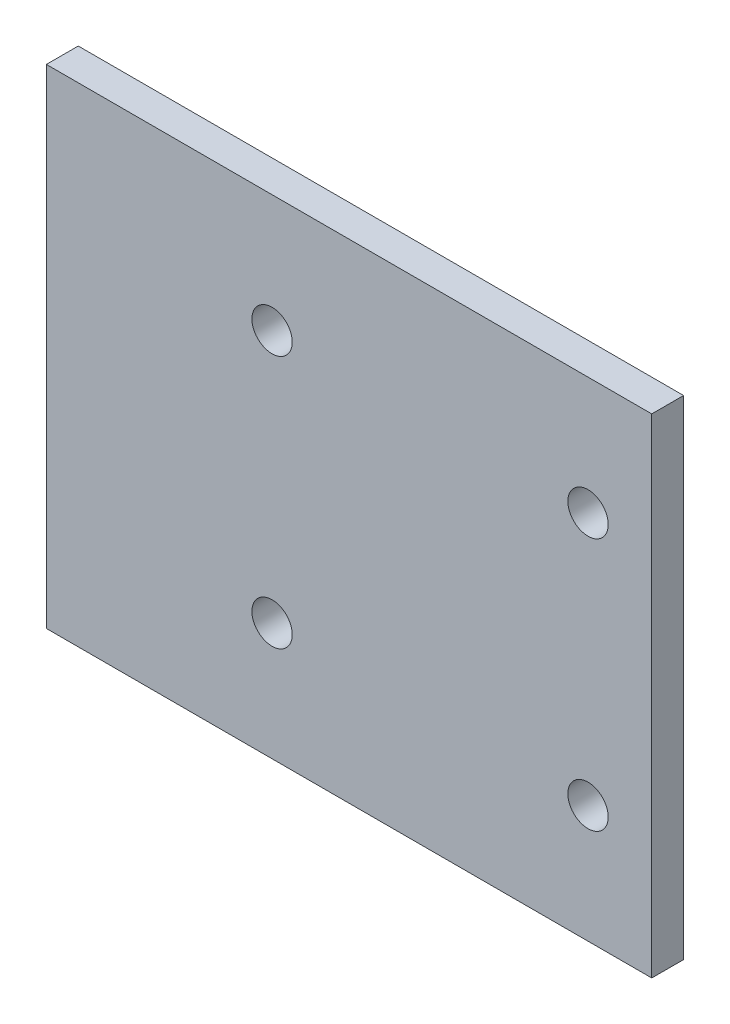
ISO-10303-21;
HEADER;
FILE_DESCRIPTION(('STEP AP214'),'2;1');
FILE_NAME('part.step','',(''),(''),'','','');
FILE_SCHEMA(('AUTOMOTIVE_DESIGN { 1 0 10303 214 1 1 1 1 }'));
ENDSEC;
DATA;
#1=APPLICATION_CONTEXT('core data for automotive mechanical design processes');
#2=APPLICATION_PROTOCOL_DEFINITION('international standard','automotive_design',2000,#1);
#3=PRODUCT_CONTEXT('',#1,'mechanical');
#4=PRODUCT('Part','Part','',(#3));
#5=PRODUCT_RELATED_PRODUCT_CATEGORY('part','',(#4));
#6=PRODUCT_DEFINITION_FORMATION('','',#4);
#7=PRODUCT_DEFINITION_CONTEXT('part definition',#1,'design');
#8=PRODUCT_DEFINITION('design','',#6,#7);
#9=PRODUCT_DEFINITION_SHAPE('','',#8);
#10=(LENGTH_UNIT() NAMED_UNIT(*) SI_UNIT(.MILLI.,.METRE.));
#11=(NAMED_UNIT(*) PLANE_ANGLE_UNIT() SI_UNIT($,.RADIAN.));
#12=(NAMED_UNIT(*) SI_UNIT($,.STERADIAN.) SOLID_ANGLE_UNIT());
#13=UNCERTAINTY_MEASURE_WITH_UNIT(LENGTH_MEASURE(1.E-05),#10,'distance_accuracy_value','');
#14=(GEOMETRIC_REPRESENTATION_CONTEXT(3) GLOBAL_UNCERTAINTY_ASSIGNED_CONTEXT((#13)) GLOBAL_UNIT_ASSIGNED_CONTEXT((#10,
#11,#12)) REPRESENTATION_CONTEXT('',''));
#15=CARTESIAN_POINT('',(0.,0.,0.));
#16=DIRECTION('',(0.,0.,1.));
#17=DIRECTION('',(1.,0.,0.));
#18=AXIS2_PLACEMENT_3D('',#15,#16,#17);
#19=CARTESIAN_POINT('',(-36.0143442622951,24.5901639344262,3.));
#20=DIRECTION('',(1.,0.,0.));
#21=DIRECTION('',(0.,0.,-1.));
#22=AXIS2_PLACEMENT_3D('',#19,#20,#21);
#23=PLANE('',#22);
#24=DIRECTION('',(0.,-1.,0.));
#25=VECTOR('',#24,1.);
#26=CARTESIAN_POINT('',(-36.0143442622951,24.5901639344262,0.));
#27=LINE('',#26,#25);
#28=CARTESIAN_POINT('',(-36.0143442622951,24.5901639344262,0.));
#29=VERTEX_POINT('',#28);
#30=CARTESIAN_POINT('',(-36.0143442622951,-21.4098360655738,0.));
#31=VERTEX_POINT('',#30);
#32=EDGE_CURVE('E96',#29,#31,#27,.T.);
#33=ORIENTED_EDGE('',*,*,#32,.T.);
#34=DIRECTION('',(0.,0.,-1.));
#35=VECTOR('',#34,1.);
#36=CARTESIAN_POINT('',(-36.0143442622951,-21.4098360655738,3.));
#37=LINE('',#36,#35);
#38=CARTESIAN_POINT('',(-36.0143442622951,-21.4098360655738,3.));
#39=VERTEX_POINT('',#38);
#40=EDGE_CURVE('E11',#39,#31,#37,.T.);
#41=ORIENTED_EDGE('',*,*,#40,.F.);
#42=DIRECTION('',(0.,-1.,0.));
#43=VECTOR('',#42,1.);
#44=CARTESIAN_POINT('',(-36.0143442622951,24.5901639344262,3.));
#45=LINE('',#44,#43);
#46=CARTESIAN_POINT('',(-36.0143442622951,24.5901639344262,3.));
#47=VERTEX_POINT('',#46);
#48=EDGE_CURVE('E84',#47,#39,#45,.T.);
#49=ORIENTED_EDGE('',*,*,#48,.F.);
#50=DIRECTION('',(0.,0.,-1.));
#51=VECTOR('',#50,1.);
#52=CARTESIAN_POINT('',(-36.0143442622951,24.5901639344262,3.));
#53=LINE('',#52,#51);
#54=EDGE_CURVE('E92',#47,#29,#53,.T.);
#55=ORIENTED_EDGE('',*,*,#54,.T.);
#56=EDGE_LOOP('',(#33,#41,#49,#55));
#57=FACE_BOUND('',#56,.T.);
#58=ADVANCED_FACE('F33',(#57),#23,.F.);
#59=CARTESIAN_POINT('',(-36.0143442622951,-21.4098360655738,3.));
#60=DIRECTION('',(0.,1.,0.));
#61=DIRECTION('',(0.,0.,1.));
#62=AXIS2_PLACEMENT_3D('',#59,#60,#61);
#63=PLANE('',#62);
#64=DIRECTION('',(1.,0.,0.));
#65=VECTOR('',#64,1.);
#66=CARTESIAN_POINT('',(-36.0143442622951,-21.4098360655738,0.));
#67=LINE('',#66,#65);
#68=CARTESIAN_POINT('',(20.9856557377049,-21.4098360655738,0.));
#69=VERTEX_POINT('',#68);
#70=EDGE_CURVE('E88',#31,#69,#67,.T.);
#71=ORIENTED_EDGE('',*,*,#70,.T.);
#72=DIRECTION('',(0.,0.,-1.));
#73=VECTOR('',#72,1.);
#74=CARTESIAN_POINT('',(20.9856557377049,-21.4098360655738,3.));
#75=LINE('',#74,#73);
#76=CARTESIAN_POINT('',(20.9856557377049,-21.4098360655738,3.));
#77=VERTEX_POINT('',#76);
#78=EDGE_CURVE('E41',#77,#69,#75,.T.);
#79=ORIENTED_EDGE('',*,*,#78,.F.);
#80=DIRECTION('',(1.,0.,0.));
#81=VECTOR('',#80,1.);
#82=CARTESIAN_POINT('',(-36.0143442622951,-21.4098360655738,3.));
#83=LINE('',#82,#81);
#84=EDGE_CURVE('E79',#39,#77,#83,.T.);
#85=ORIENTED_EDGE('',*,*,#84,.F.);
#86=ORIENTED_EDGE('',*,*,#40,.T.);
#87=EDGE_LOOP('',(#71,#79,#85,#86));
#88=FACE_BOUND('',#87,.T.);
#89=ADVANCED_FACE('F87',(#88),#63,.F.);
#90=CARTESIAN_POINT('',(20.9856557377049,24.5901639344262,3.));
#91=DIRECTION('',(-1.,0.,0.));
#92=DIRECTION('',(0.,-1.,0.));
#93=AXIS2_PLACEMENT_3D('',#90,#91,#92);
#94=PLANE('',#93);
#95=DIRECTION('',(0.,1.,0.));
#96=VECTOR('',#95,1.);
#97=CARTESIAN_POINT('',(20.9856557377049,24.5901639344262,0.));
#98=LINE('',#97,#96);
#99=CARTESIAN_POINT('',(20.9856557377049,24.5901639344262,0.));
#100=VERTEX_POINT('',#99);
#101=EDGE_CURVE('E66',#69,#100,#98,.T.);
#102=ORIENTED_EDGE('',*,*,#101,.T.);
#103=DIRECTION('',(0.,0.,-1.));
#104=VECTOR('',#103,1.);
#105=CARTESIAN_POINT('',(20.9856557377049,24.5901639344262,3.));
#106=LINE('',#105,#104);
#107=CARTESIAN_POINT('',(20.9856557377049,24.5901639344262,3.));
#108=VERTEX_POINT('',#107);
#109=EDGE_CURVE('E89',#108,#100,#106,.T.);
#110=ORIENTED_EDGE('',*,*,#109,.F.);
#111=DIRECTION('',(0.,1.,0.));
#112=VECTOR('',#111,1.);
#113=CARTESIAN_POINT('',(20.9856557377049,24.5901639344262,3.));
#114=LINE('',#113,#112);
#115=EDGE_CURVE('E82',#77,#108,#114,.T.);
#116=ORIENTED_EDGE('',*,*,#115,.F.);
#117=ORIENTED_EDGE('',*,*,#78,.T.);
#118=EDGE_LOOP('',(#102,#110,#116,#117));
#119=FACE_BOUND('',#118,.T.);
#120=ADVANCED_FACE('F90',(#119),#94,.F.);
#121=CARTESIAN_POINT('',(-36.0143442622951,24.5901639344262,3.));
#122=DIRECTION('',(0.,-1.,0.));
#123=DIRECTION('',(0.,0.,-1.));
#124=AXIS2_PLACEMENT_3D('',#121,#122,#123);
#125=PLANE('',#124);
#126=DIRECTION('',(-1.,0.,0.));
#127=VECTOR('',#126,1.);
#128=CARTESIAN_POINT('',(-36.0143442622951,24.5901639344262,0.));
#129=LINE('',#128,#127);
#130=EDGE_CURVE('E72',#100,#29,#129,.T.);
#131=ORIENTED_EDGE('',*,*,#130,.T.);
#132=ORIENTED_EDGE('',*,*,#54,.F.);
#133=DIRECTION('',(-1.,0.,0.));
#134=VECTOR('',#133,1.);
#135=CARTESIAN_POINT('',(-36.0143442622951,24.5901639344262,3.));
#136=LINE('',#135,#134);
#137=EDGE_CURVE('E49',#108,#47,#136,.T.);
#138=ORIENTED_EDGE('',*,*,#137,.F.);
#139=ORIENTED_EDGE('',*,*,#109,.T.);
#140=EDGE_LOOP('',(#131,#132,#138,#139));
#141=FACE_BOUND('',#140,.T.);
#142=ADVANCED_FACE('F104',(#141),#125,.F.);
#143=CARTESIAN_POINT('',(0.,0.,3.));
#144=DIRECTION('',(0.,0.,1.));
#145=DIRECTION('',(1.,0.,0.));
#146=AXIS2_PLACEMENT_3D('',#143,#144,#145);
#147=PLANE('',#146);
#148=CARTESIAN_POINT('',(14.9856557377049,13.5151639344262,3.));
#149=DIRECTION('',(0.,0.,1.));
#150=DIRECTION('',(1.,0.,0.));
#151=AXIS2_PLACEMENT_3D('',#148,#149,#150);
#152=CIRCLE('',#151,1.89864999999999);
#153=CARTESIAN_POINT('',(16.8843057377049,13.5151639344262,3.));
#154=VERTEX_POINT('',#153);
#155=EDGE_CURVE('E130',#154,#154,#152,.T.);
#156=ORIENTED_EDGE('',*,*,#155,.F.);
#157=EDGE_LOOP('',(#156));
#158=FACE_BOUND('',#157,.T.);
#159=CARTESIAN_POINT('',(14.9856557377049,-10.3348360655738,3.));
#160=DIRECTION('',(0.,0.,1.));
#161=DIRECTION('',(1.,0.,0.));
#162=AXIS2_PLACEMENT_3D('',#159,#160,#161);
#163=CIRCLE('',#162,1.89864999999999);
#164=CARTESIAN_POINT('',(16.8843057377049,-10.3348360655738,3.));
#165=VERTEX_POINT('',#164);
#166=EDGE_CURVE('E124',#165,#165,#163,.T.);
#167=ORIENTED_EDGE('',*,*,#166,.F.);
#168=EDGE_LOOP('',(#167));
#169=FACE_BOUND('',#168,.T.);
#170=CARTESIAN_POINT('',(-14.7643442622951,-10.3348360655738,3.));
#171=DIRECTION('',(0.,0.,1.));
#172=DIRECTION('',(1.,0.,0.));
#173=AXIS2_PLACEMENT_3D('',#170,#171,#172);
#174=CIRCLE('',#173,1.89864999999999);
#175=CARTESIAN_POINT('',(-12.8656942622951,-10.3348360655738,3.));
#176=VERTEX_POINT('',#175);
#177=EDGE_CURVE('E118',#176,#176,#174,.T.);
#178=ORIENTED_EDGE('',*,*,#177,.F.);
#179=EDGE_LOOP('',(#178));
#180=FACE_BOUND('',#179,.T.);
#181=CARTESIAN_POINT('',(-14.7643442622951,13.5151639344262,3.));
#182=DIRECTION('',(0.,0.,1.));
#183=DIRECTION('',(1.,0.,0.));
#184=AXIS2_PLACEMENT_3D('',#181,#182,#183);
#185=CIRCLE('',#184,1.89864999999999);
#186=CARTESIAN_POINT('',(-12.8656942622951,13.5151639344262,3.));
#187=VERTEX_POINT('',#186);
#188=EDGE_CURVE('E112',#187,#187,#185,.T.);
#189=ORIENTED_EDGE('',*,*,#188,.F.);
#190=EDGE_LOOP('',(#189));
#191=FACE_BOUND('',#190,.T.);
#192=ORIENTED_EDGE('',*,*,#48,.T.);
#193=ORIENTED_EDGE('',*,*,#84,.T.);
#194=ORIENTED_EDGE('',*,*,#115,.T.);
#195=ORIENTED_EDGE('',*,*,#137,.T.);
#196=EDGE_LOOP('',(#192,#193,#194,#195));
#197=FACE_BOUND('',#196,.T.);
#198=ADVANCED_FACE('F80',(#158,#169,#180,#191,#197),#147,.T.);
#199=CARTESIAN_POINT('',(0.,0.,0.));
#200=DIRECTION('',(0.,0.,1.));
#201=DIRECTION('',(1.,0.,0.));
#202=AXIS2_PLACEMENT_3D('',#199,#200,#201);
#203=PLANE('',#202);
#204=CARTESIAN_POINT('',(14.9856557377049,13.5151639344262,0.));
#205=DIRECTION('',(0.,0.,1.));
#206=DIRECTION('',(1.,0.,0.));
#207=AXIS2_PLACEMENT_3D('',#204,#205,#206);
#208=CIRCLE('',#207,1.89864999999999);
#209=CARTESIAN_POINT('',(16.8843057377049,13.5151639344262,0.));
#210=VERTEX_POINT('',#209);
#211=EDGE_CURVE('E127',#210,#210,#208,.T.);
#212=ORIENTED_EDGE('',*,*,#211,.T.);
#213=EDGE_LOOP('',(#212));
#214=FACE_BOUND('',#213,.T.);
#215=CARTESIAN_POINT('',(14.9856557377049,-10.3348360655738,0.));
#216=DIRECTION('',(0.,0.,1.));
#217=DIRECTION('',(1.,0.,0.));
#218=AXIS2_PLACEMENT_3D('',#215,#216,#217);
#219=CIRCLE('',#218,1.89864999999999);
#220=CARTESIAN_POINT('',(16.8843057377049,-10.3348360655738,0.));
#221=VERTEX_POINT('',#220);
#222=EDGE_CURVE('E121',#221,#221,#219,.T.);
#223=ORIENTED_EDGE('',*,*,#222,.T.);
#224=EDGE_LOOP('',(#223));
#225=FACE_BOUND('',#224,.T.);
#226=CARTESIAN_POINT('',(-14.7643442622951,-10.3348360655738,0.));
#227=DIRECTION('',(0.,0.,1.));
#228=DIRECTION('',(1.,0.,0.));
#229=AXIS2_PLACEMENT_3D('',#226,#227,#228);
#230=CIRCLE('',#229,1.89864999999999);
#231=CARTESIAN_POINT('',(-12.8656942622951,-10.3348360655738,0.));
#232=VERTEX_POINT('',#231);
#233=EDGE_CURVE('E115',#232,#232,#230,.T.);
#234=ORIENTED_EDGE('',*,*,#233,.T.);
#235=EDGE_LOOP('',(#234));
#236=FACE_BOUND('',#235,.T.);
#237=CARTESIAN_POINT('',(-14.7643442622951,13.5151639344262,0.));
#238=DIRECTION('',(0.,0.,1.));
#239=DIRECTION('',(1.,0.,0.));
#240=AXIS2_PLACEMENT_3D('',#237,#238,#239);
#241=CIRCLE('',#240,1.89864999999999);
#242=CARTESIAN_POINT('',(-12.8656942622951,13.5151639344262,0.));
#243=VERTEX_POINT('',#242);
#244=EDGE_CURVE('E99',#243,#243,#241,.T.);
#245=ORIENTED_EDGE('',*,*,#244,.T.);
#246=EDGE_LOOP('',(#245));
#247=FACE_BOUND('',#246,.T.);
#248=ORIENTED_EDGE('',*,*,#32,.F.);
#249=ORIENTED_EDGE('',*,*,#130,.F.);
#250=ORIENTED_EDGE('',*,*,#101,.F.);
#251=ORIENTED_EDGE('',*,*,#70,.F.);
#252=EDGE_LOOP('',(#248,#249,#250,#251));
#253=FACE_BOUND('',#252,.T.);
#254=ADVANCED_FACE('F107',(#214,#225,#236,#247,#253),#203,.F.);
#255=CARTESIAN_POINT('',(-14.7643442622951,13.5151639344262,3.));
#256=DIRECTION('',(0.,0.,1.));
#257=DIRECTION('',(1.,0.,0.));
#258=AXIS2_PLACEMENT_3D('',#255,#256,#257);
#259=CYLINDRICAL_SURFACE('',#258,1.89864999999999);
#260=ORIENTED_EDGE('',*,*,#244,.F.);
#261=EDGE_LOOP('',(#260));
#262=FACE_BOUND('',#261,.T.);
#263=ORIENTED_EDGE('',*,*,#188,.T.);
#264=EDGE_LOOP('',(#263));
#265=FACE_BOUND('',#264,.T.);
#266=ADVANCED_FACE('F145',(#262,#265),#259,.F.);
#267=CARTESIAN_POINT('',(-14.7643442622951,-10.3348360655738,3.));
#268=DIRECTION('',(0.,0.,1.));
#269=DIRECTION('',(1.,0.,0.));
#270=AXIS2_PLACEMENT_3D('',#267,#268,#269);
#271=CYLINDRICAL_SURFACE('',#270,1.89864999999999);
#272=ORIENTED_EDGE('',*,*,#233,.F.);
#273=EDGE_LOOP('',(#272));
#274=FACE_BOUND('',#273,.T.);
#275=ORIENTED_EDGE('',*,*,#177,.T.);
#276=EDGE_LOOP('',(#275));
#277=FACE_BOUND('',#276,.T.);
#278=ADVANCED_FACE('F147',(#274,#277),#271,.F.);
#279=CARTESIAN_POINT('',(14.9856557377049,-10.3348360655738,3.));
#280=DIRECTION('',(0.,0.,1.));
#281=DIRECTION('',(1.,0.,0.));
#282=AXIS2_PLACEMENT_3D('',#279,#280,#281);
#283=CYLINDRICAL_SURFACE('',#282,1.89864999999999);
#284=ORIENTED_EDGE('',*,*,#222,.F.);
#285=EDGE_LOOP('',(#284));
#286=FACE_BOUND('',#285,.T.);
#287=ORIENTED_EDGE('',*,*,#166,.T.);
#288=EDGE_LOOP('',(#287));
#289=FACE_BOUND('',#288,.T.);
#290=ADVANCED_FACE('F154',(#286,#289),#283,.F.);
#291=CARTESIAN_POINT('',(14.9856557377049,13.5151639344262,3.));
#292=DIRECTION('',(0.,0.,1.));
#293=DIRECTION('',(1.,0.,0.));
#294=AXIS2_PLACEMENT_3D('',#291,#292,#293);
#295=CYLINDRICAL_SURFACE('',#294,1.89864999999999);
#296=ORIENTED_EDGE('',*,*,#211,.F.);
#297=EDGE_LOOP('',(#296));
#298=FACE_BOUND('',#297,.T.);
#299=ORIENTED_EDGE('',*,*,#155,.T.);
#300=EDGE_LOOP('',(#299));
#301=FACE_BOUND('',#300,.T.);
#302=ADVANCED_FACE('F134',(#298,#301),#295,.F.);
#303=CLOSED_SHELL('',(#58,#89,#120,#142,#198,#254,#266,#278,#290,#302));
#304=MANIFOLD_SOLID_BREP('B2',#303);
#305=ADVANCED_BREP_SHAPE_REPRESENTATION('',(#18,#304),#14);
#306=SHAPE_DEFINITION_REPRESENTATION(#9,#305);
ENDSEC;
END-ISO-10303-21;
